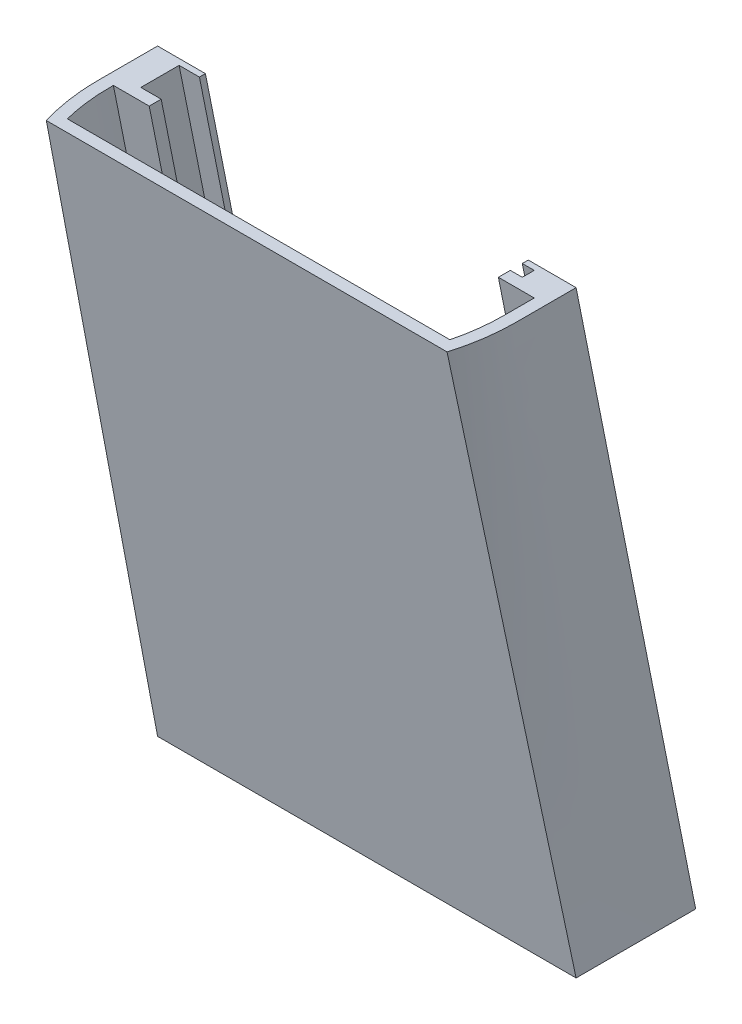
ISO-10303-21;
HEADER;
FILE_DESCRIPTION(('STEP AP214'),'2;1');
FILE_NAME('part.step','',(''),(''),'','','');
FILE_SCHEMA(('AUTOMOTIVE_DESIGN { 1 0 10303 214 1 1 1 1 }'));
ENDSEC;
DATA;
#1=APPLICATION_CONTEXT('core data for automotive mechanical design processes');
#2=APPLICATION_PROTOCOL_DEFINITION('international standard','automotive_design',2000,#1);
#3=PRODUCT_CONTEXT('',#1,'mechanical');
#4=PRODUCT('Part','Part','',(#3));
#5=PRODUCT_RELATED_PRODUCT_CATEGORY('part','',(#4));
#6=PRODUCT_DEFINITION_FORMATION('','',#4);
#7=PRODUCT_DEFINITION_CONTEXT('part definition',#1,'design');
#8=PRODUCT_DEFINITION('design','',#6,#7);
#9=PRODUCT_DEFINITION_SHAPE('','',#8);
#10=(LENGTH_UNIT() NAMED_UNIT(*) SI_UNIT(.MILLI.,.METRE.));
#11=(NAMED_UNIT(*) PLANE_ANGLE_UNIT() SI_UNIT($,.RADIAN.));
#12=(NAMED_UNIT(*) SI_UNIT($,.STERADIAN.) SOLID_ANGLE_UNIT());
#13=UNCERTAINTY_MEASURE_WITH_UNIT(LENGTH_MEASURE(1.E-05),#10,'distance_accuracy_value','');
#14=(GEOMETRIC_REPRESENTATION_CONTEXT(3) GLOBAL_UNCERTAINTY_ASSIGNED_CONTEXT((#13)) GLOBAL_UNIT_ASSIGNED_CONTEXT((#10,
#11,#12)) REPRESENTATION_CONTEXT('',''));
#15=CARTESIAN_POINT('',(0.,0.,0.));
#16=DIRECTION('',(0.,0.,1.));
#17=DIRECTION('',(1.,0.,0.));
#18=AXIS2_PLACEMENT_3D('',#15,#16,#17);
#19=CARTESIAN_POINT('',(0.,400.,0.));
#20=DIRECTION('',(0.,1.,0.));
#21=DIRECTION('',(0.,0.,1.));
#22=AXIS2_PLACEMENT_3D('',#19,#20,#21);
#23=PLANE('',#22);
#24=DIRECTION('',(0.,0.,-1.));
#25=VECTOR('',#24,1.);
#26=CARTESIAN_POINT('',(165.,400.,0.));
#27=LINE('',#26,#25);
#28=CARTESIAN_POINT('',(165.,400.,-10.));
#29=VERTEX_POINT('',#28);
#30=CARTESIAN_POINT('',(165.,400.,-75.));
#31=VERTEX_POINT('',#30);
#32=EDGE_CURVE('E511',#29,#31,#27,.T.);
#33=ORIENTED_EDGE('',*,*,#32,.T.);
#34=DIRECTION('',(-1.,0.,0.));
#35=VECTOR('',#34,1.);
#36=CARTESIAN_POINT('',(0.,400.,-75.));
#37=LINE('',#36,#35);
#38=CARTESIAN_POINT('',(135.,400.,-75.));
#39=VERTEX_POINT('',#38);
#40=EDGE_CURVE('E483',#31,#39,#37,.T.);
#41=ORIENTED_EDGE('',*,*,#40,.T.);
#42=DIRECTION('',(0.,0.,1.));
#43=VECTOR('',#42,1.);
#44=CARTESIAN_POINT('',(135.,400.,0.));
#45=LINE('',#44,#43);
#46=CARTESIAN_POINT('',(135.,400.,-85.));
#47=VERTEX_POINT('',#46);
#48=EDGE_CURVE('E543',#47,#39,#45,.T.);
#49=ORIENTED_EDGE('',*,*,#48,.F.);
#50=DIRECTION('',(-1.,0.,0.));
#51=VECTOR('',#50,1.);
#52=CARTESIAN_POINT('',(0.,400.,-85.));
#53=LINE('',#52,#51);
#54=CARTESIAN_POINT('',(145.,400.,-85.));
#55=VERTEX_POINT('',#54);
#56=EDGE_CURVE('E546',#55,#47,#53,.T.);
#57=ORIENTED_EDGE('',*,*,#56,.F.);
#58=DIRECTION('',(0.,0.,1.));
#59=VECTOR('',#58,1.);
#60=CARTESIAN_POINT('',(145.,400.,0.));
#61=LINE('',#60,#59);
#62=CARTESIAN_POINT('',(145.,400.,-95.));
#63=VERTEX_POINT('',#62);
#64=EDGE_CURVE('E734',#63,#55,#61,.T.);
#65=ORIENTED_EDGE('',*,*,#64,.F.);
#66=DIRECTION('',(-1.,0.,0.));
#67=VECTOR('',#66,1.);
#68=CARTESIAN_POINT('',(0.,400.,-95.));
#69=LINE('',#68,#67);
#70=CARTESIAN_POINT('',(135.,400.,-95.));
#71=VERTEX_POINT('',#70);
#72=EDGE_CURVE('E479',#63,#71,#69,.T.);
#73=ORIENTED_EDGE('',*,*,#72,.T.);
#74=DIRECTION('',(0.,0.,1.));
#75=VECTOR('',#74,1.);
#76=CARTESIAN_POINT('',(135.,400.,0.));
#77=LINE('',#76,#75);
#78=CARTESIAN_POINT('',(135.,400.,-100.));
#79=VERTEX_POINT('',#78);
#80=EDGE_CURVE('E618',#79,#71,#77,.T.);
#81=ORIENTED_EDGE('',*,*,#80,.F.);
#82=DIRECTION('',(-1.,0.,0.));
#83=VECTOR('',#82,1.);
#84=CARTESIAN_POINT('',(-175.,400.,-100.));
#85=LINE('',#84,#83);
#86=CARTESIAN_POINT('',(175.,400.,-100.));
#87=VERTEX_POINT('',#86);
#88=EDGE_CURVE('E458',#87,#79,#85,.T.);
#89=ORIENTED_EDGE('',*,*,#88,.F.);
#90=DIRECTION('',(0.,0.,-1.));
#91=VECTOR('',#90,1.);
#92=CARTESIAN_POINT('',(175.,400.,0.));
#93=LINE('',#92,#91);
#94=CARTESIAN_POINT('',(175.,400.,0.));
#95=VERTEX_POINT('',#94);
#96=EDGE_CURVE('E194',#95,#87,#93,.T.);
#97=ORIENTED_EDGE('',*,*,#96,.F.);
#98=DIRECTION('',(1.,0.,0.));
#99=VECTOR('',#98,1.);
#100=CARTESIAN_POINT('',(-175.,400.,0.));
#101=LINE('',#100,#99);
#102=CARTESIAN_POINT('',(-175.,400.,0.));
#103=VERTEX_POINT('',#102);
#104=EDGE_CURVE('E322',#103,#95,#101,.T.);
#105=ORIENTED_EDGE('',*,*,#104,.F.);
#106=DIRECTION('',(0.,0.,1.));
#107=VECTOR('',#106,1.);
#108=CARTESIAN_POINT('',(-175.,400.,0.));
#109=LINE('',#108,#107);
#110=CARTESIAN_POINT('',(-175.,400.,-100.));
#111=VERTEX_POINT('',#110);
#112=EDGE_CURVE('E325',#111,#103,#109,.T.);
#113=ORIENTED_EDGE('',*,*,#112,.F.);
#114=DIRECTION('',(1.,0.,0.));
#115=VECTOR('',#114,1.);
#116=CARTESIAN_POINT('',(0.,400.,-100.));
#117=LINE('',#116,#115);
#118=CARTESIAN_POINT('',(-135.,400.,-100.));
#119=VERTEX_POINT('',#118);
#120=EDGE_CURVE('E478',#111,#119,#117,.T.);
#121=ORIENTED_EDGE('',*,*,#120,.T.);
#122=DIRECTION('',(0.,0.,1.));
#123=VECTOR('',#122,1.);
#124=CARTESIAN_POINT('',(-135.,400.,0.));
#125=LINE('',#124,#123);
#126=CARTESIAN_POINT('',(-135.,400.,-95.));
#127=VERTEX_POINT('',#126);
#128=EDGE_CURVE('E480',#119,#127,#125,.T.);
#129=ORIENTED_EDGE('',*,*,#128,.T.);
#130=DIRECTION('',(1.,0.,0.));
#131=VECTOR('',#130,1.);
#132=CARTESIAN_POINT('',(1.55104687263808E-13,400.,-94.9999999999998));
#133=LINE('',#132,#131);
#134=CARTESIAN_POINT('',(-152.,400.,-95.));
#135=VERTEX_POINT('',#134);
#136=EDGE_CURVE('E730',#135,#127,#133,.T.);
#137=ORIENTED_EDGE('',*,*,#136,.F.);
#138=DIRECTION('',(0.,0.,1.));
#139=VECTOR('',#138,1.);
#140=CARTESIAN_POINT('',(-152.,400.,1.31838984174237E-13));
#141=LINE('',#140,#139);
#142=CARTESIAN_POINT('',(-152.,400.,-63.));
#143=VERTEX_POINT('',#142);
#144=EDGE_CURVE('E485',#135,#143,#141,.T.);
#145=ORIENTED_EDGE('',*,*,#144,.T.);
#146=DIRECTION('',(1.,0.,0.));
#147=VECTOR('',#146,1.);
#148=CARTESIAN_POINT('',(0.,400.,-63.));
#149=LINE('',#148,#147);
#150=CARTESIAN_POINT('',(-135.,400.,-63.));
#151=VERTEX_POINT('',#150);
#152=EDGE_CURVE('E490',#143,#151,#149,.T.);
#153=ORIENTED_EDGE('',*,*,#152,.T.);
#154=DIRECTION('',(0.,0.,1.));
#155=VECTOR('',#154,1.);
#156=CARTESIAN_POINT('',(-135.,400.,0.));
#157=LINE('',#156,#155);
#158=CARTESIAN_POINT('',(-135.,400.,-53.));
#159=VERTEX_POINT('',#158);
#160=EDGE_CURVE('E508',#151,#159,#157,.T.);
#161=ORIENTED_EDGE('',*,*,#160,.T.);
#162=DIRECTION('',(1.,0.,0.));
#163=VECTOR('',#162,1.);
#164=CARTESIAN_POINT('',(0.,400.,-53.));
#165=LINE('',#164,#163);
#166=CARTESIAN_POINT('',(-165.,400.,-53.));
#167=VERTEX_POINT('',#166);
#168=EDGE_CURVE('E731',#167,#159,#165,.T.);
#169=ORIENTED_EDGE('',*,*,#168,.F.);
#170=DIRECTION('',(0.,0.,-1.));
#171=VECTOR('',#170,1.);
#172=CARTESIAN_POINT('',(-165.,400.,-1.06503952943692E-13));
#173=LINE('',#172,#171);
#174=CARTESIAN_POINT('',(-165.,400.,-9.99999999999996));
#175=VERTEX_POINT('',#174);
#176=EDGE_CURVE('E47',#175,#167,#173,.T.);
#177=ORIENTED_EDGE('',*,*,#176,.F.);
#178=DIRECTION('',(-1.,0.,0.));
#179=VECTOR('',#178,1.);
#180=CARTESIAN_POINT('',(0.,400.,-9.99999999999998));
#181=LINE('',#180,#179);
#182=EDGE_CURVE('E11',#29,#175,#181,.T.);
#183=ORIENTED_EDGE('',*,*,#182,.F.);
#184=EDGE_LOOP('',(#33,#41,#49,#57,#65,#73,#81,#89,#97,#105,#113,#121,#129,#137,#145,#153,#161,
#169,#177,#183));
#185=FACE_BOUND('',#184,.T.);
#186=ADVANCED_FACE('F37',(#185),#23,.F.);
#187=CARTESIAN_POINT('',(145.,400.,-95.));
#188=DIRECTION('',(-1.,0.,0.));
#189=DIRECTION('',(0.,0.,1.));
#190=AXIS2_PLACEMENT_3D('',#187,#188,#189);
#191=PLANE('',#190);
#192=ORIENTED_EDGE('',*,*,#64,.T.);
#193=DIRECTION('',(0.,0.98058067569092,0.196116135138184));
#194=VECTOR('',#193,1.);
#195=CARTESIAN_POINT('',(145.,650.,-35.));
#196=LINE('',#195,#194);
#197=CARTESIAN_POINT('',(145.,900.,15.));
#198=VERTEX_POINT('',#197);
#199=EDGE_CURVE('E388',#55,#198,#196,.T.);
#200=ORIENTED_EDGE('',*,*,#199,.T.);
#201=DIRECTION('',(0.,0.,1.));
#202=VECTOR('',#201,1.);
#203=CARTESIAN_POINT('',(145.,900.,0.));
#204=LINE('',#203,#202);
#205=CARTESIAN_POINT('',(145.,900.,5.00000000000003));
#206=VERTEX_POINT('',#205);
#207=EDGE_CURVE('E571',#206,#198,#204,.T.);
#208=ORIENTED_EDGE('',*,*,#207,.F.);
#209=DIRECTION('',(0.,0.98058067569092,0.196116135138184));
#210=VECTOR('',#209,1.);
#211=CARTESIAN_POINT('',(145.,650.,-45.));
#212=LINE('',#211,#210);
#213=EDGE_CURVE('E392',#63,#206,#212,.T.);
#214=ORIENTED_EDGE('',*,*,#213,.F.);
#215=EDGE_LOOP('',(#192,#200,#208,#214));
#216=FACE_BOUND('',#215,.T.);
#217=ADVANCED_FACE('F294',(#216),#191,.T.);
#218=CARTESIAN_POINT('',(145.,400.,-85.));
#219=DIRECTION('',(0.,0.196116135138184,-0.98058067569092));
#220=DIRECTION('',(-1.,0.,0.));
#221=AXIS2_PLACEMENT_3D('',#218,#219,#220);
#222=PLANE('',#221);
#223=ORIENTED_EDGE('',*,*,#56,.T.);
#224=DIRECTION('',(0.,0.98058067569092,0.196116135138184));
#225=VECTOR('',#224,1.);
#226=CARTESIAN_POINT('',(135.,650.,-35.));
#227=LINE('',#226,#225);
#228=CARTESIAN_POINT('',(135.,900.,15.));
#229=VERTEX_POINT('',#228);
#230=EDGE_CURVE('E386',#47,#229,#227,.T.);
#231=ORIENTED_EDGE('',*,*,#230,.T.);
#232=DIRECTION('',(-1.,0.,0.));
#233=VECTOR('',#232,1.);
#234=CARTESIAN_POINT('',(0.,900.,15.));
#235=LINE('',#234,#233);
#236=EDGE_CURVE('E565',#198,#229,#235,.T.);
#237=ORIENTED_EDGE('',*,*,#236,.F.);
#238=ORIENTED_EDGE('',*,*,#199,.F.);
#239=EDGE_LOOP('',(#223,#231,#237,#238));
#240=FACE_BOUND('',#239,.T.);
#241=ADVANCED_FACE('F755',(#240),#222,.T.);
#242=CARTESIAN_POINT('',(135.,400.,-85.));
#243=DIRECTION('',(-1.,0.,0.));
#244=DIRECTION('',(0.,0.,1.));
#245=AXIS2_PLACEMENT_3D('',#242,#243,#244);
#246=PLANE('',#245);
#247=ORIENTED_EDGE('',*,*,#48,.T.);
#248=DIRECTION('',(0.,0.98058067569092,0.196116135138184));
#249=VECTOR('',#248,1.);
#250=CARTESIAN_POINT('',(135.,650.,-25.));
#251=LINE('',#250,#249);
#252=CARTESIAN_POINT('',(135.,900.,25.));
#253=VERTEX_POINT('',#252);
#254=EDGE_CURVE('E209',#39,#253,#251,.T.);
#255=ORIENTED_EDGE('',*,*,#254,.T.);
#256=DIRECTION('',(0.,0.,1.));
#257=VECTOR('',#256,1.);
#258=CARTESIAN_POINT('',(135.,900.,0.));
#259=LINE('',#258,#257);
#260=EDGE_CURVE('E558',#229,#253,#259,.T.);
#261=ORIENTED_EDGE('',*,*,#260,.F.);
#262=ORIENTED_EDGE('',*,*,#230,.F.);
#263=EDGE_LOOP('',(#247,#255,#261,#262));
#264=FACE_BOUND('',#263,.T.);
#265=ADVANCED_FACE('F296',(#264),#246,.T.);
#266=CARTESIAN_POINT('',(135.,400.,-75.));
#267=DIRECTION('',(0.,-0.196116135138184,0.98058067569092));
#268=DIRECTION('',(1.,0.,0.));
#269=AXIS2_PLACEMENT_3D('',#266,#267,#268);
#270=PLANE('',#269);
#271=ORIENTED_EDGE('',*,*,#40,.F.);
#272=DIRECTION('',(0.,-0.98058067569092,-0.196116135138184));
#273=VECTOR('',#272,1.);
#274=CARTESIAN_POINT('',(165.,650.,-25.));
#275=LINE('',#274,#273);
#276=CARTESIAN_POINT('',(165.,900.,25.));
#277=VERTEX_POINT('',#276);
#278=EDGE_CURVE('E538',#277,#31,#275,.T.);
#279=ORIENTED_EDGE('',*,*,#278,.F.);
#280=DIRECTION('',(-1.,0.,0.));
#281=VECTOR('',#280,1.);
#282=CARTESIAN_POINT('',(0.,900.,25.));
#283=LINE('',#282,#281);
#284=EDGE_CURVE('E560',#277,#253,#283,.T.);
#285=ORIENTED_EDGE('',*,*,#284,.T.);
#286=ORIENTED_EDGE('',*,*,#254,.F.);
#287=EDGE_LOOP('',(#271,#279,#285,#286));
#288=FACE_BOUND('',#287,.T.);
#289=ADVANCED_FACE('F561',(#288),#270,.T.);
#290=CARTESIAN_POINT('',(165.,400.,-75.));
#291=CARTESIAN_POINT('',(165.,900.,25.));
#292=CARTESIAN_POINT('',(165.,400.,-72.9437307322537));
#293=CARTESIAN_POINT('',(165.,900.,27.0849652074155));
#294=CARTESIAN_POINT('',(165.,400.,-68.8287061700931));
#295=CARTESIAN_POINT('',(165.,900.,31.2524449759827));
#296=CARTESIAN_POINT('',(165.,400.,-62.6524283970205));
#297=CARTESIAN_POINT('',(165.,900.,37.5000000000001));
#298=CARTESIAN_POINT('',(165.,400.,-56.4761506239478));
#299=CARTESIAN_POINT('',(165.,900.,43.7475550240173));
#300=CARTESIAN_POINT('',(165.,400.,-52.3611260617873));
#301=CARTESIAN_POINT('',(165.,900.,47.9150347925845));
#302=CARTESIAN_POINT('',(165.,400.,-46.9444593951206));
#303=CARTESIAN_POINT('',(165.,900.,53.4072928853596));
#304=CARTESIAN_POINT('',(165.,400.,-40.2261554151914));
#305=CARTESIAN_POINT('',(164.788832012848,900.,60.2243278634177));
#306=CARTESIAN_POINT('',(165.,400.,-30.1524283970204));
#307=CARTESIAN_POINT('',(163.838832553568,900.,70.4142805275075));
#308=CARTESIAN_POINT('',(165.,400.,-20.0787013788496));
#309=CARTESIAN_POINT('',(162.259274498389,900.,80.5257903365989));
#310=CARTESIAN_POINT('',(165.,400.,-13.3603973989204));
#311=CARTESIAN_POINT('',(160.791154835168,900.,87.1862094274165));
#312=CARTESIAN_POINT('',(165.,400.,-10.));
#313=CARTESIAN_POINT('',(159.955039800396,900.,90.4893225734122));
#314=B_SPLINE_SURFACE_WITH_KNOTS('',3,1,((#290,#291),(#292,#293),(#294,#295),(#296,#297),(#298,
#299),(#300,#301),(#302,#303),(#304,#305),(#306,#307),(#308,#309),(#310,#311),(#312,#313)),
.UNSPECIFIED.,.F.,.F.,.F.,(4,1,1,1,2,1,1,1,4),(2,2),(0.,0.0949047354344448,0.18980947086889,
0.284714206303334,0.379618941737779,0.534714206303334,0.68980947086889,0.844904735434445,1.),
(0.,1.),.UNSPECIFIED.);
#315=DIRECTION('',(-0.00989163092237736,0.980347765989622,0.19702896578131));
#316=VECTOR('',#315,1.);
#317=CARTESIAN_POINT('',(162.477519900198,650.,40.2446612867061));
#318=LINE('',#317,#316);
#319=CARTESIAN_POINT('',(159.955039800396,900.,90.4893225734122));
#320=VERTEX_POINT('',#319);
#321=EDGE_CURVE('E544',#29,#320,#318,.T.);
#322=CARTESIAN_POINT('',(0.,900.,50.));
#323=DIRECTION('',(0.,1.,0.));
#324=DIRECTION('',(0.,0.,1.));
#325=AXIS2_PLACEMENT_3D('',#322,#323,#324);
#326=CIRCLE('',#325,165.);
#327=CARTESIAN_POINT('',(165.,900.,50.));
#328=VERTEX_POINT('',#327);
#329=EDGE_CURVE('E633',#320,#328,#326,.T.);
#330=DIRECTION('',(0.,0.,-1.));
#331=VECTOR('',#330,1.);
#332=CARTESIAN_POINT('',(165.,900.,0.));
#333=LINE('',#332,#331);
#334=EDGE_CURVE('E540',#328,#277,#333,.T.);
#335=ORIENTED_EDGE('',*,*,#32,.F.);
#336=ORIENTED_EDGE('',*,*,#321,.T.);
#337=ORIENTED_EDGE('',*,*,#329,.T.);
#338=ORIENTED_EDGE('',*,*,#334,.T.);
#339=ORIENTED_EDGE('',*,*,#278,.T.);
#340=EDGE_LOOP('',(#335,#336,#337,#338,#339));
#341=FACE_BOUND('',#340,.T.);
#342=ADVANCED_FACE('F245',(#341),#314,.T.);
#343=CARTESIAN_POINT('',(165.,400.,-10.));
#344=DIRECTION('',(0.,0.197038605575472,-0.980395730260426));
#345=DIRECTION('',(-1.,0.,0.));
#346=AXIS2_PLACEMENT_3D('',#343,#344,#345);
#347=PLANE('',#346);
#348=ORIENTED_EDGE('',*,*,#182,.T.);
#349=DIRECTION('',(0.00989163092237731,0.980347765989622,0.19702896578131));
#350=VECTOR('',#349,1.);
#351=CARTESIAN_POINT('',(-162.477519900198,650.,40.2446612867062));
#352=LINE('',#351,#350);
#353=CARTESIAN_POINT('',(-159.955039800396,900.,90.4893225734123));
#354=VERTEX_POINT('',#353);
#355=EDGE_CURVE('E548',#175,#354,#352,.T.);
#356=ORIENTED_EDGE('',*,*,#355,.T.);
#357=DIRECTION('',(-1.,0.,0.));
#358=VECTOR('',#357,1.);
#359=CARTESIAN_POINT('',(0.,900.,90.4893225734122));
#360=LINE('',#359,#358);
#361=EDGE_CURVE('E566',#320,#354,#360,.T.);
#362=ORIENTED_EDGE('',*,*,#361,.F.);
#363=ORIENTED_EDGE('',*,*,#321,.F.);
#364=EDGE_LOOP('',(#348,#356,#362,#363));
#365=FACE_BOUND('',#364,.T.);
#366=ADVANCED_FACE('F787',(#365),#347,.T.);
#367=CARTESIAN_POINT('',(-165.,400.,-9.99999999999996));
#368=CARTESIAN_POINT('',(-159.955039800396,900.,90.4893225734123));
#369=CARTESIAN_POINT('',(-165.,400.,-13.5833333333333));
#370=CARTESIAN_POINT('',(-160.854216691239,900.,86.9370804952275));
#371=CARTESIAN_POINT('',(-165.,400.,-20.75));
#372=CARTESIAN_POINT('',(-162.413915864427,900.000000000003,79.7805098924264));
#373=CARTESIAN_POINT('',(-165.,400.,-31.5));
#374=CARTESIAN_POINT('',(-164.033307654824,899.999999999997,68.9257375001017));
#375=CARTESIAN_POINT('',(-165.,400.,-42.25));
#376=CARTESIAN_POINT('',(-164.928349331951,900.000000000003,57.9873914708251));
#377=CARTESIAN_POINT('',(-165.,400.,-49.4166666666667));
#378=CARTESIAN_POINT('',(-165.039348278595,900.,50.6636735941205));
#379=CARTESIAN_POINT('',(-165.,400.,-53.));
#380=CARTESIAN_POINT('',(-164.97272501841,900.,47.));
#381=B_SPLINE_SURFACE_WITH_KNOTS('',3,1,((#367,#368),(#369,#370),(#371,#372),(#373,#374),(#375,
#376),(#377,#378),(#379,#380)),.UNSPECIFIED.,.F.,.F.,.F.,(4,1,1,1,4),(2,2),(0.,0.25,0.5,0.75,
1.),(0.,1.),.UNSPECIFIED.);
#382=DIRECTION('',(5.3490639676885E-05,0.980580674288077,0.196116134857616));
#383=VECTOR('',#382,1.);
#384=CARTESIAN_POINT('',(-164.986362509205,650.,-2.99999999999999));
#385=LINE('',#384,#383);
#386=CARTESIAN_POINT('',(-164.97272501841,900.,47.));
#387=VERTEX_POINT('',#386);
#388=EDGE_CURVE('E675',#167,#387,#385,.T.);
#389=CARTESIAN_POINT('',(-164.97272501841,900.,47.));
#390=CARTESIAN_POINT('',(-165.006074855085,899.999999999999,48.8332605322234));
#391=CARTESIAN_POINT('',(-165.008840665537,900.,50.6670764890175));
#392=CARTESIAN_POINT('',(-164.953258730205,900.,54.3336508919822));
#393=CARTESIAN_POINT('',(-164.894915356621,900.000000000001,56.1664094044235));
#394=CARTESIAN_POINT('',(-164.717174189229,900.000000000001,59.8289658588996));
#395=CARTESIAN_POINT('',(-164.597776315234,900.000000000001,61.6587637970429));
#396=CARTESIAN_POINT('',(-164.298054053175,899.999999999999,65.3134899399577));
#397=CARTESIAN_POINT('',(-164.117725476675,899.999999999999,67.1384178012611));
#398=CARTESIAN_POINT('',(-163.697342853077,899.999999999999,70.772610271187));
#399=CARTESIAN_POINT('',(-163.457576093416,900.,72.5819081182143));
#400=CARTESIAN_POINT('',(-162.918137589467,900.,76.1916845411993));
#401=CARTESIAN_POINT('',(-162.618461547228,900.,77.9921624749077));
#402=CARTESIAN_POINT('',(-161.959355783468,900.,81.5831865834226));
#403=CARTESIAN_POINT('',(-161.599892806078,900.,83.3737266543722));
#404=CARTESIAN_POINT('',(-160.821765732166,900.,86.9417656678937));
#405=CARTESIAN_POINT('',(-160.403105763705,900.,88.7192655107331));
#406=CARTESIAN_POINT('',(-159.955039800396,900.,90.4893225734123));
#407=B_SPLINE_CURVE_WITH_KNOTS('',3,(#389,#390,#391,#392,#393,#394,#395,#396,#397,#398,#399,
#400,#401,#402,#403,#404,#405,#406),.UNSPECIFIED.,.F.,.F.,(4,2,2,2,2,2,2,2,4),(0.,
5.50043556979368,11.0004776249953,16.5005269038465,22.0009543383531,27.4752974669218,
32.9500334714071,38.4278249890152,43.9052347048175),.UNSPECIFIED.);
#408=EDGE_CURVE('E635',#387,#354,#407,.T.);
#409=ORIENTED_EDGE('',*,*,#176,.T.);
#410=ORIENTED_EDGE('',*,*,#388,.T.);
#411=ORIENTED_EDGE('',*,*,#408,.T.);
#412=ORIENTED_EDGE('',*,*,#355,.F.);
#413=EDGE_LOOP('',(#409,#410,#411,#412));
#414=FACE_BOUND('',#413,.T.);
#415=ADVANCED_FACE('F249',(#414),#381,.T.);
#416=CARTESIAN_POINT('',(-165.,400.,-53.));
#417=DIRECTION('',(0.,-0.196116135138184,0.98058067569092));
#418=DIRECTION('',(1.,0.,0.));
#419=AXIS2_PLACEMENT_3D('',#416,#417,#418);
#420=PLANE('',#419);
#421=ORIENTED_EDGE('',*,*,#168,.T.);
#422=DIRECTION('',(0.,0.98058067569092,0.196116135138184));
#423=VECTOR('',#422,1.);
#424=CARTESIAN_POINT('',(-135.,650.,-3.));
#425=LINE('',#424,#423);
#426=CARTESIAN_POINT('',(-135.,900.,47.));
#427=VERTEX_POINT('',#426);
#428=EDGE_CURVE('E677',#159,#427,#425,.T.);
#429=ORIENTED_EDGE('',*,*,#428,.T.);
#430=DIRECTION('',(1.,0.,0.));
#431=VECTOR('',#430,1.);
#432=CARTESIAN_POINT('',(0.,900.,47.));
#433=LINE('',#432,#431);
#434=EDGE_CURVE('E569',#387,#427,#433,.T.);
#435=ORIENTED_EDGE('',*,*,#434,.F.);
#436=ORIENTED_EDGE('',*,*,#388,.F.);
#437=EDGE_LOOP('',(#421,#429,#435,#436));
#438=FACE_BOUND('',#437,.T.);
#439=ADVANCED_FACE('F674',(#438),#420,.T.);
#440=CARTESIAN_POINT('',(-135.,400.,-53.));
#441=DIRECTION('',(1.,0.,0.));
#442=DIRECTION('',(0.,0.,-1.));
#443=AXIS2_PLACEMENT_3D('',#440,#441,#442);
#444=PLANE('',#443);
#445=ORIENTED_EDGE('',*,*,#160,.F.);
#446=DIRECTION('',(0.,0.98058067569092,0.196116135138184));
#447=VECTOR('',#446,1.);
#448=CARTESIAN_POINT('',(-135.,650.,-13.));
#449=LINE('',#448,#447);
#450=CARTESIAN_POINT('',(-135.,900.,37.));
#451=VERTEX_POINT('',#450);
#452=EDGE_CURVE('E683',#151,#451,#449,.T.);
#453=ORIENTED_EDGE('',*,*,#452,.T.);
#454=DIRECTION('',(0.,0.,1.));
#455=VECTOR('',#454,1.);
#456=CARTESIAN_POINT('',(-135.,900.,0.));
#457=LINE('',#456,#455);
#458=EDGE_CURVE('E638',#451,#427,#457,.T.);
#459=ORIENTED_EDGE('',*,*,#458,.T.);
#460=ORIENTED_EDGE('',*,*,#428,.F.);
#461=EDGE_LOOP('',(#445,#453,#459,#460));
#462=FACE_BOUND('',#461,.T.);
#463=ADVANCED_FACE('F779',(#462),#444,.T.);
#464=CARTESIAN_POINT('',(-135.,400.,-63.));
#465=DIRECTION('',(0.,0.196116135138184,-0.98058067569092));
#466=DIRECTION('',(-1.,0.,0.));
#467=AXIS2_PLACEMENT_3D('',#464,#465,#466);
#468=PLANE('',#467);
#469=ORIENTED_EDGE('',*,*,#152,.F.);
#470=DIRECTION('',(0.,0.98058067569092,0.196116135138184));
#471=VECTOR('',#470,1.);
#472=CARTESIAN_POINT('',(-152.,650.,-13.));
#473=LINE('',#472,#471);
#474=CARTESIAN_POINT('',(-152.,900.,37.));
#475=VERTEX_POINT('',#474);
#476=EDGE_CURVE('E696',#143,#475,#473,.T.);
#477=ORIENTED_EDGE('',*,*,#476,.T.);
#478=DIRECTION('',(1.,0.,0.));
#479=VECTOR('',#478,1.);
#480=CARTESIAN_POINT('',(0.,900.,37.));
#481=LINE('',#480,#479);
#482=EDGE_CURVE('E652',#475,#451,#481,.T.);
#483=ORIENTED_EDGE('',*,*,#482,.T.);
#484=ORIENTED_EDGE('',*,*,#452,.F.);
#485=EDGE_LOOP('',(#469,#477,#483,#484));
#486=FACE_BOUND('',#485,.T.);
#487=ADVANCED_FACE('F773',(#486),#468,.T.);
#488=CARTESIAN_POINT('',(-152.,400.,-63.));
#489=DIRECTION('',(1.,0.,0.));
#490=DIRECTION('',(0.,0.,-1.));
#491=AXIS2_PLACEMENT_3D('',#488,#489,#490);
#492=PLANE('',#491);
#493=ORIENTED_EDGE('',*,*,#144,.F.);
#494=DIRECTION('',(0.,0.98058067569092,0.196116135138184));
#495=VECTOR('',#494,1.);
#496=CARTESIAN_POINT('',(-152.,650.,-45.));
#497=LINE('',#496,#495);
#498=CARTESIAN_POINT('',(-152.,900.,5.));
#499=VERTEX_POINT('',#498);
#500=EDGE_CURVE('E701',#135,#499,#497,.T.);
#501=ORIENTED_EDGE('',*,*,#500,.T.);
#502=DIRECTION('',(0.,0.,1.));
#503=VECTOR('',#502,1.);
#504=CARTESIAN_POINT('',(-152.,900.,0.));
#505=LINE('',#504,#503);
#506=EDGE_CURVE('E655',#499,#475,#505,.T.);
#507=ORIENTED_EDGE('',*,*,#506,.T.);
#508=ORIENTED_EDGE('',*,*,#476,.F.);
#509=EDGE_LOOP('',(#493,#501,#507,#508));
#510=FACE_BOUND('',#509,.T.);
#511=ADVANCED_FACE('F768',(#510),#492,.T.);
#512=CARTESIAN_POINT('',(-152.,400.,-95.));
#513=DIRECTION('',(0.,-0.196116135138184,0.98058067569092));
#514=DIRECTION('',(1.,0.,0.));
#515=AXIS2_PLACEMENT_3D('',#512,#513,#514);
#516=PLANE('',#515);
#517=ORIENTED_EDGE('',*,*,#136,.T.);
#518=DIRECTION('',(0.,0.98058067569092,0.196116135138184));
#519=VECTOR('',#518,1.);
#520=CARTESIAN_POINT('',(-135.,650.,-45.));
#521=LINE('',#520,#519);
#522=CARTESIAN_POINT('',(-135.,900.,4.99999999999999));
#523=VERTEX_POINT('',#522);
#524=EDGE_CURVE('E706',#127,#523,#521,.T.);
#525=ORIENTED_EDGE('',*,*,#524,.T.);
#526=DIRECTION('',(1.,0.,0.));
#527=VECTOR('',#526,1.);
#528=CARTESIAN_POINT('',(0.,900.,4.99999999999988));
#529=LINE('',#528,#527);
#530=EDGE_CURVE('E666',#499,#523,#529,.T.);
#531=ORIENTED_EDGE('',*,*,#530,.F.);
#532=ORIENTED_EDGE('',*,*,#500,.F.);
#533=EDGE_LOOP('',(#517,#525,#531,#532));
#534=FACE_BOUND('',#533,.T.);
#535=ADVANCED_FACE('F728',(#534),#516,.T.);
#536=CARTESIAN_POINT('',(135.,400.,-95.));
#537=DIRECTION('',(0.,-0.196116135138184,0.98058067569092));
#538=DIRECTION('',(1.,0.,0.));
#539=AXIS2_PLACEMENT_3D('',#536,#537,#538);
#540=PLANE('',#539);
#541=ORIENTED_EDGE('',*,*,#72,.F.);
#542=ORIENTED_EDGE('',*,*,#213,.T.);
#543=DIRECTION('',(-1.,0.,0.));
#544=VECTOR('',#543,1.);
#545=CARTESIAN_POINT('',(0.,900.,5.00000000000003));
#546=LINE('',#545,#544);
#547=CARTESIAN_POINT('',(135.,900.,5.00000000000003));
#548=VERTEX_POINT('',#547);
#549=EDGE_CURVE('E210',#206,#548,#546,.T.);
#550=ORIENTED_EDGE('',*,*,#549,.T.);
#551=DIRECTION('',(0.,0.98058067569092,0.196116135138184));
#552=VECTOR('',#551,1.);
#553=CARTESIAN_POINT('',(135.,650.,-45.));
#554=LINE('',#553,#552);
#555=EDGE_CURVE('E397',#71,#548,#554,.T.);
#556=ORIENTED_EDGE('',*,*,#555,.F.);
#557=EDGE_LOOP('',(#541,#542,#550,#556));
#558=FACE_BOUND('',#557,.T.);
#559=ADVANCED_FACE('F620',(#558),#540,.T.);
#560=CARTESIAN_POINT('',(-135.,400.,-95.));
#561=DIRECTION('',(1.,0.,0.));
#562=DIRECTION('',(0.,0.,-1.));
#563=AXIS2_PLACEMENT_3D('',#560,#561,#562);
#564=PLANE('',#563);
#565=ORIENTED_EDGE('',*,*,#128,.F.);
#566=DIRECTION('',(0.,0.98058067569092,0.196116135138184));
#567=VECTOR('',#566,1.);
#568=CARTESIAN_POINT('',(-135.,650.,-50.));
#569=LINE('',#568,#567);
#570=CARTESIAN_POINT('',(-135.,900.,0.));
#571=VERTEX_POINT('',#570);
#572=EDGE_CURVE('E337',#119,#571,#569,.T.);
#573=ORIENTED_EDGE('',*,*,#572,.T.);
#574=DIRECTION('',(0.,0.,1.));
#575=VECTOR('',#574,1.);
#576=CARTESIAN_POINT('',(-135.,900.,0.));
#577=LINE('',#576,#575);
#578=EDGE_CURVE('E658',#571,#523,#577,.T.);
#579=ORIENTED_EDGE('',*,*,#578,.T.);
#580=ORIENTED_EDGE('',*,*,#524,.F.);
#581=EDGE_LOOP('',(#565,#573,#579,#580));
#582=FACE_BOUND('',#581,.T.);
#583=ADVANCED_FACE('F725',(#582),#564,.T.);
#584=CARTESIAN_POINT('',(135.,400.,-100.));
#585=DIRECTION('',(-1.,0.,0.));
#586=DIRECTION('',(0.,0.,1.));
#587=AXIS2_PLACEMENT_3D('',#584,#585,#586);
#588=PLANE('',#587);
#589=ORIENTED_EDGE('',*,*,#80,.T.);
#590=ORIENTED_EDGE('',*,*,#555,.T.);
#591=DIRECTION('',(0.,0.,1.));
#592=VECTOR('',#591,1.);
#593=CARTESIAN_POINT('',(135.,900.,0.));
#594=LINE('',#593,#592);
#595=CARTESIAN_POINT('',(135.,900.,0.));
#596=VERTEX_POINT('',#595);
#597=EDGE_CURVE('E219',#596,#548,#594,.T.);
#598=ORIENTED_EDGE('',*,*,#597,.F.);
#599=DIRECTION('',(0.,0.98058067569092,0.196116135138184));
#600=VECTOR('',#599,1.);
#601=CARTESIAN_POINT('',(135.,650.,-50.));
#602=LINE('',#601,#600);
#603=EDGE_CURVE('E199',#79,#596,#602,.T.);
#604=ORIENTED_EDGE('',*,*,#603,.F.);
#605=EDGE_LOOP('',(#589,#590,#598,#604));
#606=FACE_BOUND('',#605,.T.);
#607=ADVANCED_FACE('F417',(#606),#588,.T.);
#608=CARTESIAN_POINT('',(-135.,400.,-100.));
#609=DIRECTION('',(0.,0.196116135138184,-0.98058067569092));
#610=DIRECTION('',(-1.,0.,0.));
#611=AXIS2_PLACEMENT_3D('',#608,#609,#610);
#612=PLANE('',#611);
#613=ORIENTED_EDGE('',*,*,#120,.F.);
#614=DIRECTION('',(0.,0.98058067569092,0.196116135138184));
#615=VECTOR('',#614,1.);
#616=CARTESIAN_POINT('',(-175.,650.,-50.));
#617=LINE('',#616,#615);
#618=CARTESIAN_POINT('',(-175.,900.,0.));
#619=VERTEX_POINT('',#618);
#620=EDGE_CURVE('E334',#111,#619,#617,.T.);
#621=ORIENTED_EDGE('',*,*,#620,.T.);
#622=DIRECTION('',(1.,0.,0.));
#623=VECTOR('',#622,1.);
#624=CARTESIAN_POINT('',(0.,900.,1.21430643318377E-13));
#625=LINE('',#624,#623);
#626=EDGE_CURVE('E41',#619,#571,#625,.T.);
#627=ORIENTED_EDGE('',*,*,#626,.T.);
#628=ORIENTED_EDGE('',*,*,#572,.F.);
#629=EDGE_LOOP('',(#613,#621,#627,#628));
#630=FACE_BOUND('',#629,.T.);
#631=ADVANCED_FACE('F362',(#630),#612,.T.);
#632=CARTESIAN_POINT('',(175.,400.,-100.));
#633=DIRECTION('',(0.,0.196116135138184,-0.98058067569092));
#634=DIRECTION('',(-1.,0.,0.));
#635=AXIS2_PLACEMENT_3D('',#632,#633,#634);
#636=PLANE('',#635);
#637=ORIENTED_EDGE('',*,*,#88,.T.);
#638=ORIENTED_EDGE('',*,*,#603,.T.);
#639=DIRECTION('',(1.,0.,0.));
#640=VECTOR('',#639,1.);
#641=CARTESIAN_POINT('',(0.,900.,1.82145964977565E-13));
#642=LINE('',#641,#640);
#643=CARTESIAN_POINT('',(175.,900.,0.));
#644=VERTEX_POINT('',#643);
#645=EDGE_CURVE('E202',#596,#644,#642,.T.);
#646=ORIENTED_EDGE('',*,*,#645,.T.);
#647=DIRECTION('',(0.,0.98058067569092,0.196116135138184));
#648=VECTOR('',#647,1.);
#649=CARTESIAN_POINT('',(175.,650.,-50.));
#650=LINE('',#649,#648);
#651=EDGE_CURVE('E184',#87,#644,#650,.T.);
#652=ORIENTED_EDGE('',*,*,#651,.F.);
#653=EDGE_LOOP('',(#637,#638,#646,#652));
#654=FACE_BOUND('',#653,.T.);
#655=ADVANCED_FACE('F204',(#654),#636,.T.);
#656=CARTESIAN_POINT('',(-175.,400.,-100.));
#657=CARTESIAN_POINT('',(-175.,900.,0.));
#658=CARTESIAN_POINT('',(-175.,400.,-95.8797809710667));
#659=CARTESIAN_POINT('',(-175.,900.,4.17037767217039));
#660=CARTESIAN_POINT('',(-175.,400.,-87.6336904119237));
#661=CARTESIAN_POINT('',(-175.,900.000000000001,12.5055591782212));
#662=CARTESIAN_POINT('',(-175.,400.,-75.2560451348069));
#663=CARTESIAN_POINT('',(-175.,899.999999999998,25.));
#664=CARTESIAN_POINT('',(-175.,400.,-62.8783998576906));
#665=CARTESIAN_POINT('',(-175.,900.000000000001,37.4944408217788));
#666=CARTESIAN_POINT('',(-175.,400.,-54.6323092985474));
#667=CARTESIAN_POINT('',(-175.,900.,45.8296223278296));
#668=CARTESIAN_POINT('',(-175.,400.,-46.2989759652141));
#669=CARTESIAN_POINT('',(-175.,900.,54.2644038184428));
#670=CARTESIAN_POINT('',(-175.,400.,-37.8784150312202));
#671=CARTESIAN_POINT('',(-174.688068697995,900.000000000002,62.7987811226769));
#672=CARTESIAN_POINT('',(-175.,400.,-25.2560451348071));
#673=CARTESIAN_POINT('',(-173.284327931167,899.999999999998,75.5401925611976));
#674=CARTESIAN_POINT('',(-175.,400.,-12.6336752383938));
#675=CARTESIAN_POINT('',(-170.952347190503,900.000000000001,88.144791698468));
#676=CARTESIAN_POINT('',(-175.,400.,-4.21311430440002));
#677=CARTESIAN_POINT('',(-168.788757426725,900.,96.406255033875));
#678=CARTESIAN_POINT('',(-175.,400.,0.));
#679=CARTESIAN_POINT('',(-167.558432512595,900.,100.489322573412));
#680=B_SPLINE_SURFACE_WITH_KNOTS('',3,1,((#656,#657),(#658,#659),(#660,#661),(#662,#663),(#664,
#665),(#666,#667),(#668,#669),(#670,#671),(#672,#673),(#674,#675),(#676,#677),(#678,#679)),
.UNSPECIFIED.,.F.,.F.,.F.,(4,1,1,1,2,1,1,1,4),(2,2),(0.,0.123606570867999,0.247213141735999,
0.370819712603998,0.494426283471997,0.620819712603998,0.747213141735999,0.873606570867999,1.),
(0.,1.),.UNSPECIFIED.);
#681=DIRECTION('',(0.0145898089224685,0.980291379952039,0.197017633391872));
#682=VECTOR('',#681,1.);
#683=CARTESIAN_POINT('',(-171.279216256298,650.,50.2446612867061));
#684=LINE('',#683,#682);
#685=CARTESIAN_POINT('',(-167.558432512595,900.,100.489322573412));
#686=VERTEX_POINT('',#685);
#687=EDGE_CURVE('E330',#103,#686,#684,.T.);
#688=CARTESIAN_POINT('',(-167.558432512595,900.,100.489322573412));
#689=CARTESIAN_POINT('',(-171.259133766226,900.,88.2078406748545));
#690=CARTESIAN_POINT('',(-173.129621268287,900.,75.5173905148865));
#691=CARTESIAN_POINT('',(-175.,900.,62.8276783147653));
#692=CARTESIAN_POINT('',(-175.,900.,50.0000000000003));
#693=B_SPLINE_CURVE_WITH_KNOTS('',2,(#688,#689,#690,#691,#692),.UNSPECIFIED.,.F.,.F.,(3,2,3),
(0.,0.5,1.),.UNSPECIFIED.);
#694=CARTESIAN_POINT('',(-175.,900.,50.));
#695=VERTEX_POINT('',#694);
#696=EDGE_CURVE('E277',#686,#695,#693,.T.);
#697=DIRECTION('',(0.,0.,-1.));
#698=VECTOR('',#697,1.);
#699=CARTESIAN_POINT('',(-175.,900.,0.));
#700=LINE('',#699,#698);
#701=EDGE_CURVE('E55',#695,#619,#700,.T.);
#702=ORIENTED_EDGE('',*,*,#112,.T.);
#703=ORIENTED_EDGE('',*,*,#687,.T.);
#704=ORIENTED_EDGE('',*,*,#696,.T.);
#705=ORIENTED_EDGE('',*,*,#701,.T.);
#706=ORIENTED_EDGE('',*,*,#620,.F.);
#707=EDGE_LOOP('',(#702,#703,#704,#705,#706));
#708=FACE_BOUND('',#707,.T.);
#709=ADVANCED_FACE('F348',(#708),#680,.T.);
#710=CARTESIAN_POINT('',(175.,400.,0.));
#711=CARTESIAN_POINT('',(167.558432512595,900.,100.489322573412));
#712=CARTESIAN_POINT('',(175.,400.,-4.21311430440001));
#713=CARTESIAN_POINT('',(168.788757426725,900.,96.406255033875));
#714=CARTESIAN_POINT('',(175.,400.,-12.6336752383938));
#715=CARTESIAN_POINT('',(170.952347190503,899.999999999999,88.1447916984681));
#716=CARTESIAN_POINT('',(175.,400.,-25.2560451348071));
#717=CARTESIAN_POINT('',(173.284327931167,900.000000000001,75.5401925611975));
#718=CARTESIAN_POINT('',(175.,400.,-37.8784150312202));
#719=CARTESIAN_POINT('',(174.688068697995,899.999999999999,62.798781122677));
#720=CARTESIAN_POINT('',(175.,400.,-46.298975965214));
#721=CARTESIAN_POINT('',(175.,900.,54.2644038184429));
#722=CARTESIAN_POINT('',(175.,400.,-54.6323092985473));
#723=CARTESIAN_POINT('',(175.,900.,45.8296223278296));
#724=CARTESIAN_POINT('',(175.,400.,-62.8783998576905));
#725=CARTESIAN_POINT('',(175.,900.000000000001,37.4944408217788));
#726=CARTESIAN_POINT('',(175.,400.,-75.2560451348069));
#727=CARTESIAN_POINT('',(175.,899.999999999999,25.));
#728=CARTESIAN_POINT('',(175.,400.,-87.6336904119236));
#729=CARTESIAN_POINT('',(175.,900.,12.5055591782213));
#730=CARTESIAN_POINT('',(175.,400.,-95.8797809710667));
#731=CARTESIAN_POINT('',(175.,900.,4.17037767217039));
#732=CARTESIAN_POINT('',(175.,400.,-100.));
#733=CARTESIAN_POINT('',(175.,900.,0.));
#734=B_SPLINE_SURFACE_WITH_KNOTS('',3,1,((#710,#711),(#712,#713),(#714,#715),(#716,#717),(#718,
#719),(#720,#721),(#722,#723),(#724,#725),(#726,#727),(#728,#729),(#730,#731),(#732,#733)),
.UNSPECIFIED.,.F.,.F.,.F.,(4,1,1,1,2,1,1,1,4),(2,2),(0.,0.126393429132,0.252786858264001,
0.379180287396002,0.505573716528002,0.629180287396002,0.752786858264001,0.876393429132001,1.),
(0.,1.),.UNSPECIFIED.);
#735=DIRECTION('',(0.,0.,1.));
#736=VECTOR('',#735,1.);
#737=CARTESIAN_POINT('',(175.,900.,0.));
#738=LINE('',#737,#736);
#739=CARTESIAN_POINT('',(175.,900.,50.));
#740=VERTEX_POINT('',#739);
#741=EDGE_CURVE('E189',#644,#740,#738,.T.);
#742=CARTESIAN_POINT('',(175.,900.,50.0000000000003));
#743=CARTESIAN_POINT('',(175.,900.,62.826924319099));
#744=CARTESIAN_POINT('',(173.129621268287,900.,75.5173905148864));
#745=CARTESIAN_POINT('',(171.259351301828,900.,88.2071187415307));
#746=CARTESIAN_POINT('',(167.558432512595,900.,100.489322573412));
#747=B_SPLINE_CURVE_WITH_KNOTS('',2,(#742,#743,#744,#745,#746),.UNSPECIFIED.,.F.,.F.,(3,2,3),
(0.,0.5,1.),.UNSPECIFIED.);
#748=CARTESIAN_POINT('',(167.558432512595,900.,100.489322573412));
#749=VERTEX_POINT('',#748);
#750=EDGE_CURVE('E217',#740,#749,#747,.T.);
#751=DIRECTION('',(-0.0145898089224685,0.980291379952039,0.197017633391872));
#752=VECTOR('',#751,1.);
#753=CARTESIAN_POINT('',(171.279216256298,650.,50.2446612867061));
#754=LINE('',#753,#752);
#755=EDGE_CURVE('E198',#95,#749,#754,.T.);
#756=ORIENTED_EDGE('',*,*,#96,.T.);
#757=ORIENTED_EDGE('',*,*,#651,.T.);
#758=ORIENTED_EDGE('',*,*,#741,.T.);
#759=ORIENTED_EDGE('',*,*,#750,.T.);
#760=ORIENTED_EDGE('',*,*,#755,.F.);
#761=EDGE_LOOP('',(#756,#757,#758,#759,#760));
#762=FACE_BOUND('',#761,.T.);
#763=ADVANCED_FACE('F186',(#762),#734,.T.);
#764=CARTESIAN_POINT('',(-175.,400.,0.));
#765=DIRECTION('',(0.,-0.197038605575472,0.980395730260426));
#766=DIRECTION('',(1.,0.,0.));
#767=AXIS2_PLACEMENT_3D('',#764,#765,#766);
#768=PLANE('',#767);
#769=ORIENTED_EDGE('',*,*,#104,.T.);
#770=ORIENTED_EDGE('',*,*,#755,.T.);
#771=DIRECTION('',(1.,0.,0.));
#772=VECTOR('',#771,1.);
#773=CARTESIAN_POINT('',(0.,900.,100.489322573412));
#774=LINE('',#773,#772);
#775=EDGE_CURVE('E331',#749,#686,#774,.F.);
#776=ORIENTED_EDGE('',*,*,#775,.T.);
#777=ORIENTED_EDGE('',*,*,#687,.F.);
#778=EDGE_LOOP('',(#769,#770,#776,#777));
#779=FACE_BOUND('',#778,.T.);
#780=ADVANCED_FACE('F244',(#779),#768,.T.);
#781=CARTESIAN_POINT('',(0.,900.,0.));
#782=DIRECTION('',(0.,1.,0.));
#783=DIRECTION('',(0.,0.,1.));
#784=AXIS2_PLACEMENT_3D('',#781,#782,#783);
#785=PLANE('',#784);
#786=ORIENTED_EDGE('',*,*,#284,.F.);
#787=ORIENTED_EDGE('',*,*,#334,.F.);
#788=ORIENTED_EDGE('',*,*,#329,.F.);
#789=ORIENTED_EDGE('',*,*,#361,.T.);
#790=ORIENTED_EDGE('',*,*,#408,.F.);
#791=ORIENTED_EDGE('',*,*,#434,.T.);
#792=ORIENTED_EDGE('',*,*,#458,.F.);
#793=ORIENTED_EDGE('',*,*,#482,.F.);
#794=ORIENTED_EDGE('',*,*,#506,.F.);
#795=ORIENTED_EDGE('',*,*,#530,.T.);
#796=ORIENTED_EDGE('',*,*,#578,.F.);
#797=ORIENTED_EDGE('',*,*,#626,.F.);
#798=ORIENTED_EDGE('',*,*,#701,.F.);
#799=ORIENTED_EDGE('',*,*,#696,.F.);
#800=ORIENTED_EDGE('',*,*,#775,.F.);
#801=ORIENTED_EDGE('',*,*,#750,.F.);
#802=ORIENTED_EDGE('',*,*,#741,.F.);
#803=ORIENTED_EDGE('',*,*,#645,.F.);
#804=ORIENTED_EDGE('',*,*,#597,.T.);
#805=ORIENTED_EDGE('',*,*,#549,.F.);
#806=ORIENTED_EDGE('',*,*,#207,.T.);
#807=ORIENTED_EDGE('',*,*,#236,.T.);
#808=ORIENTED_EDGE('',*,*,#260,.T.);
#809=EDGE_LOOP('',(#786,#787,#788,#789,#790,#791,#792,#793,#794,#795,#796,#797,#798,#799,#800,
#801,#802,#803,#804,#805,#806,#807,#808));
#810=FACE_BOUND('',#809,.T.);
#811=ADVANCED_FACE('F215',(#810),#785,.T.);
#812=CLOSED_SHELL('',(#186,#217,#241,#265,#289,#342,#366,#415,#439,#463,#487,#511,#535,#559,
#583,#607,#631,#655,#709,#763,#780,#811));
#813=MANIFOLD_SOLID_BREP('B2',#812);
#814=ADVANCED_BREP_SHAPE_REPRESENTATION('',(#18,#813),#14);
#815=SHAPE_DEFINITION_REPRESENTATION(#9,#814);
ENDSEC;
END-ISO-10303-21;
